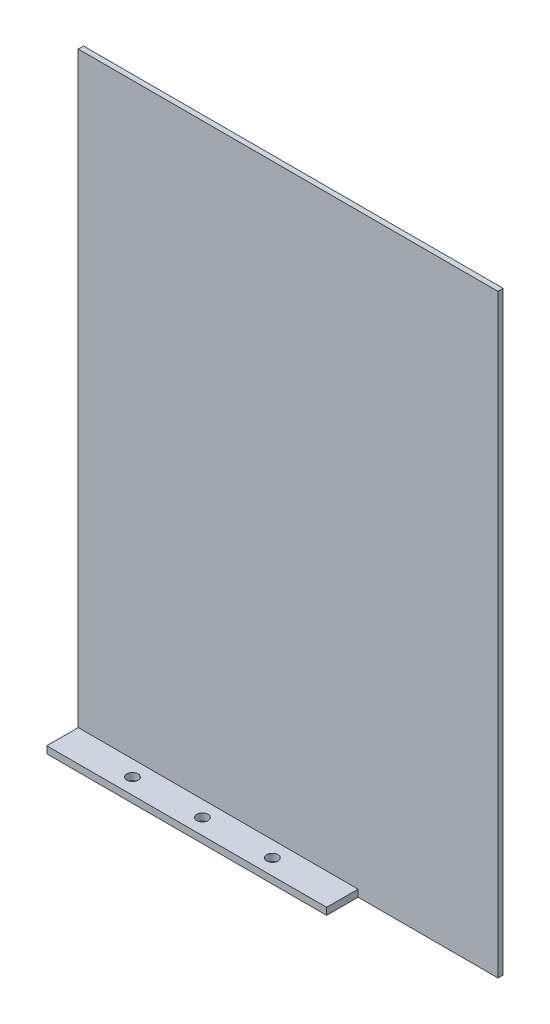
ISO-10303-21;
HEADER;
FILE_DESCRIPTION(('STEP AP214'),'2;1');
FILE_NAME('part.step','',(''),(''),'','','');
FILE_SCHEMA(('AUTOMOTIVE_DESIGN { 1 0 10303 214 1 1 1 1 }'));
ENDSEC;
DATA;
#1=APPLICATION_CONTEXT('core data for automotive mechanical design processes');
#2=APPLICATION_PROTOCOL_DEFINITION('international standard','automotive_design',2000,#1);
#3=PRODUCT_CONTEXT('',#1,'mechanical');
#4=PRODUCT('Part','Part','',(#3));
#5=PRODUCT_RELATED_PRODUCT_CATEGORY('part','',(#4));
#6=PRODUCT_DEFINITION_FORMATION('','',#4);
#7=PRODUCT_DEFINITION_CONTEXT('part definition',#1,'design');
#8=PRODUCT_DEFINITION('design','',#6,#7);
#9=PRODUCT_DEFINITION_SHAPE('','',#8);
#10=(LENGTH_UNIT() NAMED_UNIT(*) SI_UNIT(.MILLI.,.METRE.));
#11=(NAMED_UNIT(*) PLANE_ANGLE_UNIT() SI_UNIT($,.RADIAN.));
#12=(NAMED_UNIT(*) SI_UNIT($,.STERADIAN.) SOLID_ANGLE_UNIT());
#13=UNCERTAINTY_MEASURE_WITH_UNIT(LENGTH_MEASURE(1.E-05),#10,'distance_accuracy_value','');
#14=(GEOMETRIC_REPRESENTATION_CONTEXT(3) GLOBAL_UNCERTAINTY_ASSIGNED_CONTEXT((#13)) GLOBAL_UNIT_ASSIGNED_CONTEXT((#10,
#11,#12)) REPRESENTATION_CONTEXT('',''));
#15=CARTESIAN_POINT('',(0.,0.,0.));
#16=DIRECTION('',(0.,0.,1.));
#17=DIRECTION('',(1.,0.,0.));
#18=AXIS2_PLACEMENT_3D('',#15,#16,#17);
#19=CARTESIAN_POINT('',(0.,0.,1.5));
#20=DIRECTION('',(1.,0.,0.));
#21=DIRECTION('',(0.,1.,0.));
#22=AXIS2_PLACEMENT_3D('',#19,#20,#21);
#23=PLANE('',#22);
#24=DIRECTION('',(0.,-1.,0.));
#25=VECTOR('',#24,1.);
#26=CARTESIAN_POINT('',(0.,0.,0.));
#27=LINE('',#26,#25);
#28=CARTESIAN_POINT('',(0.,0.,0.));
#29=VERTEX_POINT('',#28);
#30=CARTESIAN_POINT('',(0.,-170.,0.));
#31=VERTEX_POINT('',#30);
#32=EDGE_CURVE('E100',#29,#31,#27,.T.);
#33=ORIENTED_EDGE('',*,*,#32,.T.);
#34=DIRECTION('',(0.,0.,-1.));
#35=VECTOR('',#34,1.);
#36=CARTESIAN_POINT('',(0.,-170.,1.5));
#37=LINE('',#36,#35);
#38=CARTESIAN_POINT('',(0.,-170.,10.5));
#39=VERTEX_POINT('',#38);
#40=EDGE_CURVE('E11',#39,#31,#37,.T.);
#41=ORIENTED_EDGE('',*,*,#40,.F.);
#42=DIRECTION('',(0.,-1.,0.));
#43=VECTOR('',#42,1.);
#44=CARTESIAN_POINT('',(0.,-170.,10.5));
#45=LINE('',#44,#43);
#46=CARTESIAN_POINT('',(0.,-168.,10.5));
#47=VERTEX_POINT('',#46);
#48=EDGE_CURVE('E97',#47,#39,#45,.T.);
#49=ORIENTED_EDGE('',*,*,#48,.F.);
#50=DIRECTION('',(0.,0.,-1.));
#51=VECTOR('',#50,1.);
#52=CARTESIAN_POINT('',(0.,-168.,10.5));
#53=LINE('',#52,#51);
#54=CARTESIAN_POINT('',(0.,-168.,1.5));
#55=VERTEX_POINT('',#54);
#56=EDGE_CURVE('E124',#47,#55,#53,.T.);
#57=ORIENTED_EDGE('',*,*,#56,.T.);
#58=DIRECTION('',(0.,-1.,0.));
#59=VECTOR('',#58,1.);
#60=CARTESIAN_POINT('',(0.,0.,1.5));
#61=LINE('',#60,#59);
#62=CARTESIAN_POINT('',(0.,0.,1.5));
#63=VERTEX_POINT('',#62);
#64=EDGE_CURVE('E57',#63,#55,#61,.T.);
#65=ORIENTED_EDGE('',*,*,#64,.F.);
#66=DIRECTION('',(0.,0.,-1.));
#67=VECTOR('',#66,1.);
#68=CARTESIAN_POINT('',(0.,0.,1.5));
#69=LINE('',#68,#67);
#70=EDGE_CURVE('E139',#63,#29,#69,.T.);
#71=ORIENTED_EDGE('',*,*,#70,.T.);
#72=EDGE_LOOP('',(#33,#41,#49,#57,#65,#71));
#73=FACE_BOUND('',#72,.T.);
#74=ADVANCED_FACE('F37',(#73),#23,.F.);
#75=CARTESIAN_POINT('',(0.,-170.,1.5));
#76=DIRECTION('',(0.,1.,0.));
#77=DIRECTION('',(0.,0.,1.));
#78=AXIS2_PLACEMENT_3D('',#75,#76,#77);
#79=PLANE('',#78);
#80=CARTESIAN_POINT('',(20.,-170.,6.));
#81=DIRECTION('',(0.,1.,0.));
#82=DIRECTION('',(0.,0.,1.));
#83=AXIS2_PLACEMENT_3D('',#80,#81,#82);
#84=CIRCLE('',#83,1.6);
#85=CARTESIAN_POINT('',(20.,-170.,7.6));
#86=VERTEX_POINT('',#85);
#87=EDGE_CURVE('E119',#86,#86,#84,.T.);
#88=ORIENTED_EDGE('',*,*,#87,.T.);
#89=EDGE_LOOP('',(#88));
#90=FACE_BOUND('',#89,.T.);
#91=CARTESIAN_POINT('',(40.,-170.,6.));
#92=DIRECTION('',(0.,1.,0.));
#93=DIRECTION('',(0.,0.,1.));
#94=AXIS2_PLACEMENT_3D('',#91,#92,#93);
#95=CIRCLE('',#94,1.60000000000001);
#96=CARTESIAN_POINT('',(40.,-170.,7.6));
#97=VERTEX_POINT('',#96);
#98=EDGE_CURVE('E291',#97,#97,#95,.T.);
#99=ORIENTED_EDGE('',*,*,#98,.T.);
#100=EDGE_LOOP('',(#99));
#101=FACE_BOUND('',#100,.T.);
#102=CARTESIAN_POINT('',(60.,-170.,6.));
#103=DIRECTION('',(0.,1.,0.));
#104=DIRECTION('',(0.,0.,1.));
#105=AXIS2_PLACEMENT_3D('',#102,#103,#104);
#106=CIRCLE('',#105,1.60000000000001);
#107=CARTESIAN_POINT('',(60.,-170.,7.6));
#108=VERTEX_POINT('',#107);
#109=EDGE_CURVE('E293',#108,#108,#106,.T.);
#110=ORIENTED_EDGE('',*,*,#109,.T.);
#111=EDGE_LOOP('',(#110));
#112=FACE_BOUND('',#111,.T.);
#113=DIRECTION('',(1.,0.,0.));
#114=VECTOR('',#113,1.);
#115=CARTESIAN_POINT('',(0.,-170.,0.));
#116=LINE('',#115,#114);
#117=CARTESIAN_POINT('',(120.,-170.,0.));
#118=VERTEX_POINT('',#117);
#119=EDGE_CURVE('E141',#31,#118,#116,.T.);
#120=ORIENTED_EDGE('',*,*,#119,.T.);
#121=DIRECTION('',(0.,0.,-1.));
#122=VECTOR('',#121,1.);
#123=CARTESIAN_POINT('',(120.,-170.,1.5));
#124=LINE('',#123,#122);
#125=CARTESIAN_POINT('',(120.,-170.,1.5));
#126=VERTEX_POINT('',#125);
#127=EDGE_CURVE('E44',#126,#118,#124,.T.);
#128=ORIENTED_EDGE('',*,*,#127,.F.);
#129=DIRECTION('',(1.,0.,0.));
#130=VECTOR('',#129,1.);
#131=CARTESIAN_POINT('',(0.,-170.,1.5));
#132=LINE('',#131,#130);
#133=CARTESIAN_POINT('',(80.,-170.,1.5));
#134=VERTEX_POINT('',#133);
#135=EDGE_CURVE('E132',#134,#126,#132,.T.);
#136=ORIENTED_EDGE('',*,*,#135,.F.);
#137=DIRECTION('',(0.,0.,-1.));
#138=VECTOR('',#137,1.);
#139=CARTESIAN_POINT('',(80.,-170.,10.5));
#140=LINE('',#139,#138);
#141=CARTESIAN_POINT('',(80.,-170.,10.5));
#142=VERTEX_POINT('',#141);
#143=EDGE_CURVE('E106',#142,#134,#140,.T.);
#144=ORIENTED_EDGE('',*,*,#143,.F.);
#145=DIRECTION('',(1.,0.,0.));
#146=VECTOR('',#145,1.);
#147=CARTESIAN_POINT('',(0.,-170.,10.5));
#148=LINE('',#147,#146);
#149=EDGE_CURVE('E103',#39,#142,#148,.T.);
#150=ORIENTED_EDGE('',*,*,#149,.F.);
#151=ORIENTED_EDGE('',*,*,#40,.T.);
#152=EDGE_LOOP('',(#120,#128,#136,#144,#150,#151));
#153=FACE_BOUND('',#152,.T.);
#154=ADVANCED_FACE('F104',(#90,#101,#112,#153),#79,.F.);
#155=CARTESIAN_POINT('',(120.,0.,1.5));
#156=DIRECTION('',(-1.,0.,0.));
#157=DIRECTION('',(0.,-1.,0.));
#158=AXIS2_PLACEMENT_3D('',#155,#156,#157);
#159=PLANE('',#158);
#160=DIRECTION('',(0.,1.,0.));
#161=VECTOR('',#160,1.);
#162=CARTESIAN_POINT('',(120.,0.,0.));
#163=LINE('',#162,#161);
#164=CARTESIAN_POINT('',(120.,0.,0.));
#165=VERTEX_POINT('',#164);
#166=EDGE_CURVE('E143',#118,#165,#163,.T.);
#167=ORIENTED_EDGE('',*,*,#166,.T.);
#168=DIRECTION('',(0.,0.,-1.));
#169=VECTOR('',#168,1.);
#170=CARTESIAN_POINT('',(120.,0.,1.5));
#171=LINE('',#170,#169);
#172=CARTESIAN_POINT('',(120.,0.,1.5));
#173=VERTEX_POINT('',#172);
#174=EDGE_CURVE('E147',#173,#165,#171,.T.);
#175=ORIENTED_EDGE('',*,*,#174,.F.);
#176=DIRECTION('',(0.,1.,0.));
#177=VECTOR('',#176,1.);
#178=CARTESIAN_POINT('',(120.,0.,1.5));
#179=LINE('',#178,#177);
#180=EDGE_CURVE('E135',#126,#173,#179,.T.);
#181=ORIENTED_EDGE('',*,*,#180,.F.);
#182=ORIENTED_EDGE('',*,*,#127,.T.);
#183=EDGE_LOOP('',(#167,#175,#181,#182));
#184=FACE_BOUND('',#183,.T.);
#185=ADVANCED_FACE('F154',(#184),#159,.F.);
#186=CARTESIAN_POINT('',(0.,0.,1.5));
#187=DIRECTION('',(0.,-1.,0.));
#188=DIRECTION('',(0.,0.,-1.));
#189=AXIS2_PLACEMENT_3D('',#186,#187,#188);
#190=PLANE('',#189);
#191=DIRECTION('',(-1.,0.,0.));
#192=VECTOR('',#191,1.);
#193=CARTESIAN_POINT('',(0.,0.,0.));
#194=LINE('',#193,#192);
#195=EDGE_CURVE('E133',#165,#29,#194,.T.);
#196=ORIENTED_EDGE('',*,*,#195,.T.);
#197=ORIENTED_EDGE('',*,*,#70,.F.);
#198=DIRECTION('',(-1.,0.,0.));
#199=VECTOR('',#198,1.);
#200=CARTESIAN_POINT('',(0.,0.,1.5));
#201=LINE('',#200,#199);
#202=EDGE_CURVE('E137',#173,#63,#201,.T.);
#203=ORIENTED_EDGE('',*,*,#202,.F.);
#204=ORIENTED_EDGE('',*,*,#174,.T.);
#205=EDGE_LOOP('',(#196,#197,#203,#204));
#206=FACE_BOUND('',#205,.T.);
#207=ADVANCED_FACE('F161',(#206),#190,.F.);
#208=CARTESIAN_POINT('',(0.,0.,1.5));
#209=DIRECTION('',(0.,0.,1.));
#210=DIRECTION('',(1.,0.,0.));
#211=AXIS2_PLACEMENT_3D('',#208,#209,#210);
#212=PLANE('',#211);
#213=DIRECTION('',(-1.,0.,0.));
#214=VECTOR('',#213,1.);
#215=CARTESIAN_POINT('',(0.,-168.,1.5));
#216=LINE('',#215,#214);
#217=CARTESIAN_POINT('',(80.,-168.,1.5));
#218=VERTEX_POINT('',#217);
#219=EDGE_CURVE('E115',#218,#55,#216,.T.);
#220=ORIENTED_EDGE('',*,*,#219,.F.);
#221=DIRECTION('',(0.,1.,0.));
#222=VECTOR('',#221,1.);
#223=CARTESIAN_POINT('',(80.,-170.,1.5));
#224=LINE('',#223,#222);
#225=EDGE_CURVE('E51',#134,#218,#224,.T.);
#226=ORIENTED_EDGE('',*,*,#225,.F.);
#227=ORIENTED_EDGE('',*,*,#135,.T.);
#228=ORIENTED_EDGE('',*,*,#180,.T.);
#229=ORIENTED_EDGE('',*,*,#202,.T.);
#230=ORIENTED_EDGE('',*,*,#64,.T.);
#231=EDGE_LOOP('',(#220,#226,#227,#228,#229,#230));
#232=FACE_BOUND('',#231,.T.);
#233=ADVANCED_FACE('F166',(#232),#212,.T.);
#234=CARTESIAN_POINT('',(0.,0.,0.));
#235=DIRECTION('',(0.,0.,1.));
#236=DIRECTION('',(1.,0.,0.));
#237=AXIS2_PLACEMENT_3D('',#234,#235,#236);
#238=PLANE('',#237);
#239=ORIENTED_EDGE('',*,*,#32,.F.);
#240=ORIENTED_EDGE('',*,*,#195,.F.);
#241=ORIENTED_EDGE('',*,*,#166,.F.);
#242=ORIENTED_EDGE('',*,*,#119,.F.);
#243=EDGE_LOOP('',(#239,#240,#241,#242));
#244=FACE_BOUND('',#243,.T.);
#245=ADVANCED_FACE('F158',(#244),#238,.F.);
#246=CARTESIAN_POINT('',(80.,-170.,10.5));
#247=DIRECTION('',(-1.,0.,0.));
#248=DIRECTION('',(0.,0.,1.));
#249=AXIS2_PLACEMENT_3D('',#246,#247,#248);
#250=PLANE('',#249);
#251=ORIENTED_EDGE('',*,*,#225,.T.);
#252=DIRECTION('',(0.,0.,-1.));
#253=VECTOR('',#252,1.);
#254=CARTESIAN_POINT('',(80.,-168.,10.5));
#255=LINE('',#254,#253);
#256=CARTESIAN_POINT('',(80.,-168.,10.5));
#257=VERTEX_POINT('',#256);
#258=EDGE_CURVE('E127',#257,#218,#255,.T.);
#259=ORIENTED_EDGE('',*,*,#258,.F.);
#260=DIRECTION('',(0.,1.,0.));
#261=VECTOR('',#260,1.);
#262=CARTESIAN_POINT('',(80.,-170.,10.5));
#263=LINE('',#262,#261);
#264=EDGE_CURVE('E109',#142,#257,#263,.T.);
#265=ORIENTED_EDGE('',*,*,#264,.F.);
#266=ORIENTED_EDGE('',*,*,#143,.T.);
#267=EDGE_LOOP('',(#251,#259,#265,#266));
#268=FACE_BOUND('',#267,.T.);
#269=ADVANCED_FACE('F168',(#268),#250,.F.);
#270=CARTESIAN_POINT('',(0.,-168.,10.5));
#271=DIRECTION('',(0.,-1.,0.));
#272=DIRECTION('',(0.,0.,-1.));
#273=AXIS2_PLACEMENT_3D('',#270,#271,#272);
#274=PLANE('',#273);
#275=CARTESIAN_POINT('',(20.,-168.,6.));
#276=DIRECTION('',(0.,1.,0.));
#277=DIRECTION('',(0.,0.,1.));
#278=AXIS2_PLACEMENT_3D('',#275,#276,#277);
#279=CIRCLE('',#278,1.6);
#280=CARTESIAN_POINT('',(20.,-168.,7.6));
#281=VERTEX_POINT('',#280);
#282=EDGE_CURVE('E289',#281,#281,#279,.T.);
#283=ORIENTED_EDGE('',*,*,#282,.F.);
#284=EDGE_LOOP('',(#283));
#285=FACE_BOUND('',#284,.T.);
#286=CARTESIAN_POINT('',(40.,-168.,6.));
#287=DIRECTION('',(0.,1.,0.));
#288=DIRECTION('',(0.,0.,1.));
#289=AXIS2_PLACEMENT_3D('',#286,#287,#288);
#290=CIRCLE('',#289,1.60000000000001);
#291=CARTESIAN_POINT('',(40.,-168.,7.6));
#292=VERTEX_POINT('',#291);
#293=EDGE_CURVE('E301',#292,#292,#290,.T.);
#294=ORIENTED_EDGE('',*,*,#293,.F.);
#295=EDGE_LOOP('',(#294));
#296=FACE_BOUND('',#295,.T.);
#297=CARTESIAN_POINT('',(60.,-168.,6.));
#298=DIRECTION('',(0.,1.,0.));
#299=DIRECTION('',(0.,0.,1.));
#300=AXIS2_PLACEMENT_3D('',#297,#298,#299);
#301=CIRCLE('',#300,1.60000000000001);
#302=CARTESIAN_POINT('',(60.,-168.,7.6));
#303=VERTEX_POINT('',#302);
#304=EDGE_CURVE('E298',#303,#303,#301,.T.);
#305=ORIENTED_EDGE('',*,*,#304,.F.);
#306=EDGE_LOOP('',(#305));
#307=FACE_BOUND('',#306,.T.);
#308=ORIENTED_EDGE('',*,*,#219,.T.);
#309=ORIENTED_EDGE('',*,*,#56,.F.);
#310=DIRECTION('',(-1.,0.,0.));
#311=VECTOR('',#310,1.);
#312=CARTESIAN_POINT('',(0.,-168.,10.5));
#313=LINE('',#312,#311);
#314=EDGE_CURVE('E113',#257,#47,#313,.T.);
#315=ORIENTED_EDGE('',*,*,#314,.F.);
#316=ORIENTED_EDGE('',*,*,#258,.T.);
#317=EDGE_LOOP('',(#308,#309,#315,#316));
#318=FACE_BOUND('',#317,.T.);
#319=ADVANCED_FACE('F164',(#285,#296,#307,#318),#274,.F.);
#320=CARTESIAN_POINT('',(0.,0.,10.5));
#321=DIRECTION('',(0.,0.,-1.));
#322=DIRECTION('',(-1.,0.,0.));
#323=AXIS2_PLACEMENT_3D('',#320,#321,#322);
#324=PLANE('',#323);
#325=ORIENTED_EDGE('',*,*,#48,.T.);
#326=ORIENTED_EDGE('',*,*,#149,.T.);
#327=ORIENTED_EDGE('',*,*,#264,.T.);
#328=ORIENTED_EDGE('',*,*,#314,.T.);
#329=EDGE_LOOP('',(#325,#326,#327,#328));
#330=FACE_BOUND('',#329,.T.);
#331=ADVANCED_FACE('F111',(#330),#324,.F.);
#332=CARTESIAN_POINT('',(60.,-177.,6.));
#333=DIRECTION('',(0.,1.,0.));
#334=DIRECTION('',(0.,0.,1.));
#335=AXIS2_PLACEMENT_3D('',#332,#333,#334);
#336=CYLINDRICAL_SURFACE('',#335,1.60000000000001);
#337=ORIENTED_EDGE('',*,*,#304,.T.);
#338=EDGE_LOOP('',(#337));
#339=FACE_BOUND('',#338,.T.);
#340=ORIENTED_EDGE('',*,*,#109,.F.);
#341=EDGE_LOOP('',(#340));
#342=FACE_BOUND('',#341,.T.);
#343=ADVANCED_FACE('F247',(#339,#342),#336,.F.);
#344=CARTESIAN_POINT('',(40.,-177.,6.));
#345=DIRECTION('',(0.,1.,0.));
#346=DIRECTION('',(0.,0.,1.));
#347=AXIS2_PLACEMENT_3D('',#344,#345,#346);
#348=CYLINDRICAL_SURFACE('',#347,1.60000000000001);
#349=ORIENTED_EDGE('',*,*,#293,.T.);
#350=EDGE_LOOP('',(#349));
#351=FACE_BOUND('',#350,.T.);
#352=ORIENTED_EDGE('',*,*,#98,.F.);
#353=EDGE_LOOP('',(#352));
#354=FACE_BOUND('',#353,.T.);
#355=ADVANCED_FACE('F256',(#351,#354),#348,.F.);
#356=CARTESIAN_POINT('',(20.,-177.,6.));
#357=DIRECTION('',(0.,1.,0.));
#358=DIRECTION('',(0.,0.,1.));
#359=AXIS2_PLACEMENT_3D('',#356,#357,#358);
#360=CYLINDRICAL_SURFACE('',#359,1.6);
#361=ORIENTED_EDGE('',*,*,#282,.T.);
#362=EDGE_LOOP('',(#361));
#363=FACE_BOUND('',#362,.T.);
#364=ORIENTED_EDGE('',*,*,#87,.F.);
#365=EDGE_LOOP('',(#364));
#366=FACE_BOUND('',#365,.T.);
#367=ADVANCED_FACE('F267',(#363,#366),#360,.F.);
#368=CLOSED_SHELL('',(#74,#154,#185,#207,#233,#245,#269,#319,#331,#343,#355,#367));
#369=MANIFOLD_SOLID_BREP('B2',#368);
#370=ADVANCED_BREP_SHAPE_REPRESENTATION('',(#18,#369),#14);
#371=SHAPE_DEFINITION_REPRESENTATION(#9,#370);
ENDSEC;
END-ISO-10303-21;
